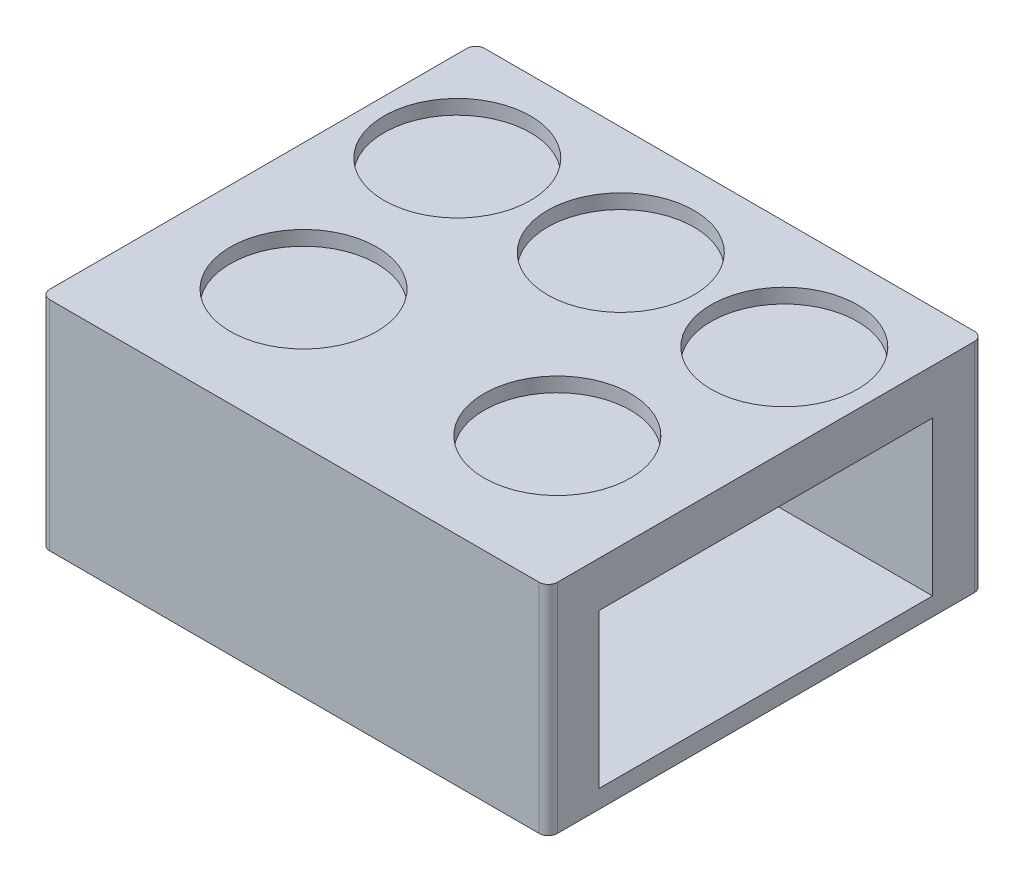
ISO-10303-21;
HEADER;
FILE_DESCRIPTION(('STEP AP214'),'2;1');
FILE_NAME('part.step','',(''),(''),'','','');
FILE_SCHEMA(('AUTOMOTIVE_DESIGN { 1 0 10303 214 1 1 1 1 }'));
ENDSEC;
DATA;
#1=APPLICATION_CONTEXT('core data for automotive mechanical design processes');
#2=APPLICATION_PROTOCOL_DEFINITION('international standard','automotive_design',2000,#1);
#3=PRODUCT_CONTEXT('',#1,'mechanical');
#4=PRODUCT('Part','Part','',(#3));
#5=PRODUCT_RELATED_PRODUCT_CATEGORY('part','',(#4));
#6=PRODUCT_DEFINITION_FORMATION('','',#4);
#7=PRODUCT_DEFINITION_CONTEXT('part definition',#1,'design');
#8=PRODUCT_DEFINITION('design','',#6,#7);
#9=PRODUCT_DEFINITION_SHAPE('','',#8);
#10=(LENGTH_UNIT() NAMED_UNIT(*) SI_UNIT(.MILLI.,.METRE.));
#11=(NAMED_UNIT(*) PLANE_ANGLE_UNIT() SI_UNIT($,.RADIAN.));
#12=(NAMED_UNIT(*) SI_UNIT($,.STERADIAN.) SOLID_ANGLE_UNIT());
#13=UNCERTAINTY_MEASURE_WITH_UNIT(LENGTH_MEASURE(1.E-05),#10,'distance_accuracy_value','');
#14=(GEOMETRIC_REPRESENTATION_CONTEXT(3) GLOBAL_UNCERTAINTY_ASSIGNED_CONTEXT((#13)) GLOBAL_UNIT_ASSIGNED_CONTEXT((#10,
#11,#12)) REPRESENTATION_CONTEXT('',''));
#15=CARTESIAN_POINT('',(0.,0.,0.));
#16=DIRECTION('',(0.,0.,1.));
#17=DIRECTION('',(1.,0.,0.));
#18=AXIS2_PLACEMENT_3D('',#15,#16,#17);
#19=CARTESIAN_POINT('',(135.,120.,-115.));
#20=DIRECTION('',(0.,-1.,0.));
#21=DIRECTION('',(0.,0.,-1.));
#22=AXIS2_PLACEMENT_3D('',#19,#20,#21);
#23=CYLINDRICAL_SURFACE('',#22,5.);
#24=CARTESIAN_POINT('',(135.,0.,-115.));
#25=DIRECTION('',(0.,1.,0.));
#26=DIRECTION('',(0.,0.,1.));
#27=AXIS2_PLACEMENT_3D('',#24,#25,#26);
#28=CIRCLE('',#27,5.);
#29=CARTESIAN_POINT('',(140.,0.,-115.));
#30=VERTEX_POINT('',#29);
#31=CARTESIAN_POINT('',(135.,0.,-120.));
#32=VERTEX_POINT('',#31);
#33=EDGE_CURVE('E182',#30,#32,#28,.T.);
#34=ORIENTED_EDGE('',*,*,#33,.T.);
#35=DIRECTION('',(0.,-1.,0.));
#36=VECTOR('',#35,1.);
#37=CARTESIAN_POINT('',(135.,120.,-120.));
#38=LINE('',#37,#36);
#39=CARTESIAN_POINT('',(135.,120.,-120.));
#40=VERTEX_POINT('',#39);
#41=EDGE_CURVE('E11',#40,#32,#38,.T.);
#42=ORIENTED_EDGE('',*,*,#41,.F.);
#43=CARTESIAN_POINT('',(135.,120.,-115.));
#44=DIRECTION('',(0.,1.,0.));
#45=DIRECTION('',(0.,0.,1.));
#46=AXIS2_PLACEMENT_3D('',#43,#44,#45);
#47=CIRCLE('',#46,5.);
#48=CARTESIAN_POINT('',(140.,120.,-115.));
#49=VERTEX_POINT('',#48);
#50=EDGE_CURVE('E183',#49,#40,#47,.T.);
#51=ORIENTED_EDGE('',*,*,#50,.F.);
#52=DIRECTION('',(0.,-1.,0.));
#53=VECTOR('',#52,1.);
#54=CARTESIAN_POINT('',(140.,120.,-115.));
#55=LINE('',#54,#53);
#56=EDGE_CURVE('E209',#49,#30,#55,.T.);
#57=ORIENTED_EDGE('',*,*,#56,.T.);
#58=EDGE_LOOP('',(#34,#42,#51,#57));
#59=FACE_BOUND('',#58,.T.);
#60=ADVANCED_FACE('F45',(#59),#23,.T.);
#61=CARTESIAN_POINT('',(0.,120.,-120.));
#62=DIRECTION('',(0.,0.,1.));
#63=DIRECTION('',(1.,0.,0.));
#64=AXIS2_PLACEMENT_3D('',#61,#62,#63);
#65=PLANE('',#64);
#66=DIRECTION('',(-1.,0.,0.));
#67=VECTOR('',#66,1.);
#68=CARTESIAN_POINT('',(0.,0.,-120.));
#69=LINE('',#68,#67);
#70=CARTESIAN_POINT('',(-135.,0.,-120.));
#71=VERTEX_POINT('',#70);
#72=EDGE_CURVE('E213',#32,#71,#69,.T.);
#73=ORIENTED_EDGE('',*,*,#72,.T.);
#74=DIRECTION('',(0.,-1.,0.));
#75=VECTOR('',#74,1.);
#76=CARTESIAN_POINT('',(-135.,120.,-120.));
#77=LINE('',#76,#75);
#78=CARTESIAN_POINT('',(-135.,120.,-120.));
#79=VERTEX_POINT('',#78);
#80=EDGE_CURVE('E53',#79,#71,#77,.T.);
#81=ORIENTED_EDGE('',*,*,#80,.F.);
#82=DIRECTION('',(-1.,0.,0.));
#83=VECTOR('',#82,1.);
#84=CARTESIAN_POINT('',(135.,120.,-120.));
#85=LINE('',#84,#83);
#86=EDGE_CURVE('E187',#40,#79,#85,.T.);
#87=ORIENTED_EDGE('',*,*,#86,.F.);
#88=ORIENTED_EDGE('',*,*,#41,.T.);
#89=EDGE_LOOP('',(#73,#81,#87,#88));
#90=FACE_BOUND('',#89,.T.);
#91=ADVANCED_FACE('F284',(#90),#65,.F.);
#92=CARTESIAN_POINT('',(-135.,120.,-115.));
#93=DIRECTION('',(0.,-1.,0.));
#94=DIRECTION('',(0.,0.,-1.));
#95=AXIS2_PLACEMENT_3D('',#92,#93,#94);
#96=CYLINDRICAL_SURFACE('',#95,5.);
#97=CARTESIAN_POINT('',(-135.,0.,-115.));
#98=DIRECTION('',(0.,1.,0.));
#99=DIRECTION('',(0.,0.,1.));
#100=AXIS2_PLACEMENT_3D('',#97,#98,#99);
#101=CIRCLE('',#100,5.);
#102=CARTESIAN_POINT('',(-140.,0.,-115.));
#103=VERTEX_POINT('',#102);
#104=EDGE_CURVE('E216',#71,#103,#101,.T.);
#105=ORIENTED_EDGE('',*,*,#104,.T.);
#106=DIRECTION('',(0.,-1.,0.));
#107=VECTOR('',#106,1.);
#108=CARTESIAN_POINT('',(-140.,120.,-115.));
#109=LINE('',#108,#107);
#110=CARTESIAN_POINT('',(-140.,120.,-115.));
#111=VERTEX_POINT('',#110);
#112=EDGE_CURVE('E252',#111,#103,#109,.T.);
#113=ORIENTED_EDGE('',*,*,#112,.F.);
#114=CARTESIAN_POINT('',(-135.,120.,-115.));
#115=DIRECTION('',(0.,1.,0.));
#116=DIRECTION('',(0.,0.,1.));
#117=AXIS2_PLACEMENT_3D('',#114,#115,#116);
#118=CIRCLE('',#117,5.);
#119=EDGE_CURVE('E191',#79,#111,#118,.T.);
#120=ORIENTED_EDGE('',*,*,#119,.F.);
#121=ORIENTED_EDGE('',*,*,#80,.T.);
#122=EDGE_LOOP('',(#105,#113,#120,#121));
#123=FACE_BOUND('',#122,.T.);
#124=ADVANCED_FACE('F261',(#123),#96,.T.);
#125=CARTESIAN_POINT('',(-140.,120.,-115.));
#126=DIRECTION('',(1.,0.,0.));
#127=DIRECTION('',(0.,0.,-1.));
#128=AXIS2_PLACEMENT_3D('',#125,#126,#127);
#129=PLANE('',#128);
#130=DIRECTION('',(0.,1.,0.));
#131=VECTOR('',#130,1.);
#132=CARTESIAN_POINT('',(-140.,120.,-92.));
#133=LINE('',#132,#131);
#134=CARTESIAN_POINT('',(-140.,9.99999999999999,-92.));
#135=VERTEX_POINT('',#134);
#136=CARTESIAN_POINT('',(-140.,95.,-92.));
#137=VERTEX_POINT('',#136);
#138=EDGE_CURVE('E174',#135,#137,#133,.T.);
#139=ORIENTED_EDGE('',*,*,#138,.T.);
#140=DIRECTION('',(0.,0.,1.));
#141=VECTOR('',#140,1.);
#142=CARTESIAN_POINT('',(-140.,95.,-115.));
#143=LINE('',#142,#141);
#144=CARTESIAN_POINT('',(-140.,95.,92.));
#145=VERTEX_POINT('',#144);
#146=EDGE_CURVE('E178',#137,#145,#143,.T.);
#147=ORIENTED_EDGE('',*,*,#146,.T.);
#148=DIRECTION('',(0.,-1.,0.));
#149=VECTOR('',#148,1.);
#150=CARTESIAN_POINT('',(-140.,120.,92.));
#151=LINE('',#150,#149);
#152=CARTESIAN_POINT('',(-140.,9.99999999999999,92.));
#153=VERTEX_POINT('',#152);
#154=EDGE_CURVE('E165',#145,#153,#151,.T.);
#155=ORIENTED_EDGE('',*,*,#154,.T.);
#156=DIRECTION('',(0.,0.,-1.));
#157=VECTOR('',#156,1.);
#158=CARTESIAN_POINT('',(-140.,9.99999999999999,-115.));
#159=LINE('',#158,#157);
#160=EDGE_CURVE('E140',#153,#135,#159,.T.);
#161=ORIENTED_EDGE('',*,*,#160,.T.);
#162=EDGE_LOOP('',(#139,#147,#155,#161));
#163=FACE_BOUND('',#162,.T.);
#164=DIRECTION('',(0.,0.,1.));
#165=VECTOR('',#164,1.);
#166=CARTESIAN_POINT('',(-140.,0.,-115.));
#167=LINE('',#166,#165);
#168=CARTESIAN_POINT('',(-140.,0.,115.));
#169=VERTEX_POINT('',#168);
#170=EDGE_CURVE('E219',#103,#169,#167,.T.);
#171=ORIENTED_EDGE('',*,*,#170,.T.);
#172=DIRECTION('',(0.,-1.,0.));
#173=VECTOR('',#172,1.);
#174=CARTESIAN_POINT('',(-140.,120.,115.));
#175=LINE('',#174,#173);
#176=CARTESIAN_POINT('',(-140.,120.,115.));
#177=VERTEX_POINT('',#176);
#178=EDGE_CURVE('E248',#177,#169,#175,.T.);
#179=ORIENTED_EDGE('',*,*,#178,.F.);
#180=DIRECTION('',(0.,0.,1.));
#181=VECTOR('',#180,1.);
#182=CARTESIAN_POINT('',(-140.,120.,-115.));
#183=LINE('',#182,#181);
#184=EDGE_CURVE('E194',#111,#177,#183,.T.);
#185=ORIENTED_EDGE('',*,*,#184,.F.);
#186=ORIENTED_EDGE('',*,*,#112,.T.);
#187=EDGE_LOOP('',(#171,#179,#185,#186));
#188=FACE_BOUND('',#187,.T.);
#189=ADVANCED_FACE('F272',(#163,#188),#129,.F.);
#190=CARTESIAN_POINT('',(-135.,120.,115.));
#191=DIRECTION('',(0.,-1.,0.));
#192=DIRECTION('',(0.,0.,-1.));
#193=AXIS2_PLACEMENT_3D('',#190,#191,#192);
#194=CYLINDRICAL_SURFACE('',#193,5.);
#195=CARTESIAN_POINT('',(-135.,0.,115.));
#196=DIRECTION('',(0.,1.,0.));
#197=DIRECTION('',(0.,0.,1.));
#198=AXIS2_PLACEMENT_3D('',#195,#196,#197);
#199=CIRCLE('',#198,5.);
#200=CARTESIAN_POINT('',(-135.,0.,120.));
#201=VERTEX_POINT('',#200);
#202=EDGE_CURVE('E222',#169,#201,#199,.T.);
#203=ORIENTED_EDGE('',*,*,#202,.T.);
#204=DIRECTION('',(0.,-1.,0.));
#205=VECTOR('',#204,1.);
#206=CARTESIAN_POINT('',(-135.,120.,120.));
#207=LINE('',#206,#205);
#208=CARTESIAN_POINT('',(-135.,120.,120.));
#209=VERTEX_POINT('',#208);
#210=EDGE_CURVE('E244',#209,#201,#207,.T.);
#211=ORIENTED_EDGE('',*,*,#210,.F.);
#212=CARTESIAN_POINT('',(-135.,120.,115.));
#213=DIRECTION('',(0.,1.,0.));
#214=DIRECTION('',(0.,0.,1.));
#215=AXIS2_PLACEMENT_3D('',#212,#213,#214);
#216=CIRCLE('',#215,5.);
#217=EDGE_CURVE('E197',#177,#209,#216,.T.);
#218=ORIENTED_EDGE('',*,*,#217,.F.);
#219=ORIENTED_EDGE('',*,*,#178,.T.);
#220=EDGE_LOOP('',(#203,#211,#218,#219));
#221=FACE_BOUND('',#220,.T.);
#222=ADVANCED_FACE('F276',(#221),#194,.T.);
#223=CARTESIAN_POINT('',(-135.,120.,120.));
#224=DIRECTION('',(0.,0.,-1.));
#225=DIRECTION('',(-1.,0.,0.));
#226=AXIS2_PLACEMENT_3D('',#223,#224,#225);
#227=PLANE('',#226);
#228=DIRECTION('',(1.,0.,0.));
#229=VECTOR('',#228,1.);
#230=CARTESIAN_POINT('',(-135.,0.,120.));
#231=LINE('',#230,#229);
#232=CARTESIAN_POINT('',(135.,0.,120.));
#233=VERTEX_POINT('',#232);
#234=EDGE_CURVE('E225',#201,#233,#231,.T.);
#235=ORIENTED_EDGE('',*,*,#234,.T.);
#236=DIRECTION('',(0.,-1.,0.));
#237=VECTOR('',#236,1.);
#238=CARTESIAN_POINT('',(135.,120.,120.));
#239=LINE('',#238,#237);
#240=CARTESIAN_POINT('',(135.,120.,120.));
#241=VERTEX_POINT('',#240);
#242=EDGE_CURVE('E240',#241,#233,#239,.T.);
#243=ORIENTED_EDGE('',*,*,#242,.F.);
#244=DIRECTION('',(1.,0.,0.));
#245=VECTOR('',#244,1.);
#246=CARTESIAN_POINT('',(-135.,120.,120.));
#247=LINE('',#246,#245);
#248=EDGE_CURVE('E200',#209,#241,#247,.T.);
#249=ORIENTED_EDGE('',*,*,#248,.F.);
#250=ORIENTED_EDGE('',*,*,#210,.T.);
#251=EDGE_LOOP('',(#235,#243,#249,#250));
#252=FACE_BOUND('',#251,.T.);
#253=ADVANCED_FACE('F295',(#252),#227,.F.);
#254=CARTESIAN_POINT('',(135.,120.,115.));
#255=DIRECTION('',(0.,-1.,0.));
#256=DIRECTION('',(0.,0.,-1.));
#257=AXIS2_PLACEMENT_3D('',#254,#255,#256);
#258=CYLINDRICAL_SURFACE('',#257,5.);
#259=CARTESIAN_POINT('',(135.,0.,115.));
#260=DIRECTION('',(0.,1.,0.));
#261=DIRECTION('',(0.,0.,1.));
#262=AXIS2_PLACEMENT_3D('',#259,#260,#261);
#263=CIRCLE('',#262,5.);
#264=CARTESIAN_POINT('',(140.,0.,115.));
#265=VERTEX_POINT('',#264);
#266=EDGE_CURVE('E228',#233,#265,#263,.T.);
#267=ORIENTED_EDGE('',*,*,#266,.T.);
#268=DIRECTION('',(0.,-1.,0.));
#269=VECTOR('',#268,1.);
#270=CARTESIAN_POINT('',(140.,120.,115.));
#271=LINE('',#270,#269);
#272=CARTESIAN_POINT('',(140.,120.,115.));
#273=VERTEX_POINT('',#272);
#274=EDGE_CURVE('E236',#273,#265,#271,.T.);
#275=ORIENTED_EDGE('',*,*,#274,.F.);
#276=CARTESIAN_POINT('',(135.,120.,115.));
#277=DIRECTION('',(0.,1.,0.));
#278=DIRECTION('',(0.,0.,1.));
#279=AXIS2_PLACEMENT_3D('',#276,#277,#278);
#280=CIRCLE('',#279,5.);
#281=EDGE_CURVE('E203',#241,#273,#280,.T.);
#282=ORIENTED_EDGE('',*,*,#281,.F.);
#283=ORIENTED_EDGE('',*,*,#242,.T.);
#284=EDGE_LOOP('',(#267,#275,#282,#283));
#285=FACE_BOUND('',#284,.T.);
#286=ADVANCED_FACE('F293',(#285),#258,.T.);
#287=CARTESIAN_POINT('',(140.,120.,115.));
#288=DIRECTION('',(-1.,0.,0.));
#289=DIRECTION('',(0.,0.,1.));
#290=AXIS2_PLACEMENT_3D('',#287,#288,#289);
#291=PLANE('',#290);
#292=DIRECTION('',(0.,-1.,0.));
#293=VECTOR('',#292,1.);
#294=CARTESIAN_POINT('',(140.,95.,92.));
#295=LINE('',#294,#293);
#296=CARTESIAN_POINT('',(140.,95.,92.));
#297=VERTEX_POINT('',#296);
#298=CARTESIAN_POINT('',(140.,9.99999999999999,92.));
#299=VERTEX_POINT('',#298);
#300=EDGE_CURVE('E147',#297,#299,#295,.T.);
#301=ORIENTED_EDGE('',*,*,#300,.F.);
#302=DIRECTION('',(0.,0.,1.));
#303=VECTOR('',#302,1.);
#304=CARTESIAN_POINT('',(140.,95.,92.));
#305=LINE('',#304,#303);
#306=CARTESIAN_POINT('',(140.,95.,-92.));
#307=VERTEX_POINT('',#306);
#308=EDGE_CURVE('E68',#307,#297,#305,.T.);
#309=ORIENTED_EDGE('',*,*,#308,.F.);
#310=DIRECTION('',(0.,1.,0.));
#311=VECTOR('',#310,1.);
#312=CARTESIAN_POINT('',(140.,9.99999999999999,-92.));
#313=LINE('',#312,#311);
#314=CARTESIAN_POINT('',(140.,9.99999999999999,-92.));
#315=VERTEX_POINT('',#314);
#316=EDGE_CURVE('E155',#315,#307,#313,.T.);
#317=ORIENTED_EDGE('',*,*,#316,.F.);
#318=DIRECTION('',(0.,0.,-1.));
#319=VECTOR('',#318,1.);
#320=CARTESIAN_POINT('',(140.,9.99999999999999,92.));
#321=LINE('',#320,#319);
#322=EDGE_CURVE('E137',#299,#315,#321,.T.);
#323=ORIENTED_EDGE('',*,*,#322,.F.);
#324=EDGE_LOOP('',(#301,#309,#317,#323));
#325=FACE_BOUND('',#324,.T.);
#326=DIRECTION('',(0.,0.,-1.));
#327=VECTOR('',#326,1.);
#328=CARTESIAN_POINT('',(140.,0.,115.));
#329=LINE('',#328,#327);
#330=EDGE_CURVE('E188',#265,#30,#329,.T.);
#331=ORIENTED_EDGE('',*,*,#330,.T.);
#332=ORIENTED_EDGE('',*,*,#56,.F.);
#333=DIRECTION('',(0.,0.,-1.));
#334=VECTOR('',#333,1.);
#335=CARTESIAN_POINT('',(140.,120.,115.));
#336=LINE('',#335,#334);
#337=EDGE_CURVE('E206',#273,#49,#336,.T.);
#338=ORIENTED_EDGE('',*,*,#337,.F.);
#339=ORIENTED_EDGE('',*,*,#274,.T.);
#340=EDGE_LOOP('',(#331,#332,#338,#339));
#341=FACE_BOUND('',#340,.T.);
#342=ADVANCED_FACE('F152',(#325,#341),#291,.F.);
#343=CARTESIAN_POINT('',(135.,120.,-115.));
#344=DIRECTION('',(0.,1.,0.));
#345=DIRECTION('',(0.,0.,1.));
#346=AXIS2_PLACEMENT_3D('',#343,#344,#345);
#347=PLANE('',#346);
#348=CARTESIAN_POINT('',(-70.,120.,45.));
#349=DIRECTION('',(0.,1.,0.));
#350=DIRECTION('',(0.,0.,-1.));
#351=AXIS2_PLACEMENT_3D('',#348,#349,#350);
#352=CIRCLE('',#351,40.4);
#353=CARTESIAN_POINT('',(-70.,120.,4.59999999999998));
#354=VERTEX_POINT('',#353);
#355=EDGE_CURVE('E486',#354,#354,#352,.T.);
#356=ORIENTED_EDGE('',*,*,#355,.F.);
#357=EDGE_LOOP('',(#356));
#358=FACE_BOUND('',#357,.T.);
#359=CARTESIAN_POINT('',(0.,120.,-60.));
#360=DIRECTION('',(0.,1.,0.));
#361=DIRECTION('',(0.,0.,1.));
#362=AXIS2_PLACEMENT_3D('',#359,#360,#361);
#363=CIRCLE('',#362,40.4);
#364=CARTESIAN_POINT('',(0.,120.,-19.6));
#365=VERTEX_POINT('',#364);
#366=EDGE_CURVE('E487',#365,#365,#363,.T.);
#367=ORIENTED_EDGE('',*,*,#366,.F.);
#368=EDGE_LOOP('',(#367));
#369=FACE_BOUND('',#368,.T.);
#370=CARTESIAN_POINT('',(-90.2,120.,-60.));
#371=DIRECTION('',(0.,1.,0.));
#372=DIRECTION('',(0.,0.,1.));
#373=AXIS2_PLACEMENT_3D('',#370,#371,#372);
#374=CIRCLE('',#373,40.4);
#375=CARTESIAN_POINT('',(-90.2,120.,-19.6));
#376=VERTEX_POINT('',#375);
#377=EDGE_CURVE('E502',#376,#376,#374,.T.);
#378=ORIENTED_EDGE('',*,*,#377,.F.);
#379=EDGE_LOOP('',(#378));
#380=FACE_BOUND('',#379,.T.);
#381=CARTESIAN_POINT('',(90.2,120.,-60.));
#382=DIRECTION('',(0.,1.,0.));
#383=DIRECTION('',(0.,0.,1.));
#384=AXIS2_PLACEMENT_3D('',#381,#382,#383);
#385=CIRCLE('',#384,40.4);
#386=CARTESIAN_POINT('',(90.2,120.,-19.6));
#387=VERTEX_POINT('',#386);
#388=EDGE_CURVE('E523',#387,#387,#385,.T.);
#389=ORIENTED_EDGE('',*,*,#388,.F.);
#390=EDGE_LOOP('',(#389));
#391=FACE_BOUND('',#390,.T.);
#392=CARTESIAN_POINT('',(70.,120.,45.));
#393=DIRECTION('',(0.,1.,0.));
#394=DIRECTION('',(0.,0.,1.));
#395=AXIS2_PLACEMENT_3D('',#392,#393,#394);
#396=CIRCLE('',#395,40.4);
#397=CARTESIAN_POINT('',(70.,120.,85.4));
#398=VERTEX_POINT('',#397);
#399=EDGE_CURVE('E492',#398,#398,#396,.T.);
#400=ORIENTED_EDGE('',*,*,#399,.F.);
#401=EDGE_LOOP('',(#400));
#402=FACE_BOUND('',#401,.T.);
#403=ORIENTED_EDGE('',*,*,#50,.T.);
#404=ORIENTED_EDGE('',*,*,#86,.T.);
#405=ORIENTED_EDGE('',*,*,#119,.T.);
#406=ORIENTED_EDGE('',*,*,#184,.T.);
#407=ORIENTED_EDGE('',*,*,#217,.T.);
#408=ORIENTED_EDGE('',*,*,#248,.T.);
#409=ORIENTED_EDGE('',*,*,#281,.T.);
#410=ORIENTED_EDGE('',*,*,#337,.T.);
#411=EDGE_LOOP('',(#403,#404,#405,#406,#407,#408,#409,#410));
#412=FACE_BOUND('',#411,.T.);
#413=ADVANCED_FACE('F280',(#358,#369,#380,#391,#402,#412),#347,.T.);
#414=CARTESIAN_POINT('',(135.,0.,-115.));
#415=DIRECTION('',(0.,1.,0.));
#416=DIRECTION('',(0.,0.,1.));
#417=AXIS2_PLACEMENT_3D('',#414,#415,#416);
#418=PLANE('',#417);
#419=ORIENTED_EDGE('',*,*,#33,.F.);
#420=ORIENTED_EDGE('',*,*,#330,.F.);
#421=ORIENTED_EDGE('',*,*,#266,.F.);
#422=ORIENTED_EDGE('',*,*,#234,.F.);
#423=ORIENTED_EDGE('',*,*,#202,.F.);
#424=ORIENTED_EDGE('',*,*,#170,.F.);
#425=ORIENTED_EDGE('',*,*,#104,.F.);
#426=ORIENTED_EDGE('',*,*,#72,.F.);
#427=EDGE_LOOP('',(#419,#420,#421,#422,#423,#424,#425,#426));
#428=FACE_BOUND('',#427,.T.);
#429=ADVANCED_FACE('F267',(#428),#418,.F.);
#430=CARTESIAN_POINT('',(-230.,95.,92.));
#431=DIRECTION('',(0.,1.,0.));
#432=DIRECTION('',(0.,0.,1.));
#433=AXIS2_PLACEMENT_3D('',#430,#431,#432);
#434=PLANE('',#433);
#435=DIRECTION('',(1.,0.,0.));
#436=VECTOR('',#435,1.);
#437=CARTESIAN_POINT('',(-230.,95.,-92.));
#438=LINE('',#437,#436);
#439=EDGE_CURVE('E162',#137,#307,#438,.T.);
#440=ORIENTED_EDGE('',*,*,#439,.T.);
#441=ORIENTED_EDGE('',*,*,#308,.T.);
#442=DIRECTION('',(1.,0.,0.));
#443=VECTOR('',#442,1.);
#444=CARTESIAN_POINT('',(-230.,95.,92.));
#445=LINE('',#444,#443);
#446=EDGE_CURVE('E144',#145,#297,#445,.T.);
#447=ORIENTED_EDGE('',*,*,#446,.F.);
#448=ORIENTED_EDGE('',*,*,#146,.F.);
#449=EDGE_LOOP('',(#440,#441,#447,#448));
#450=FACE_BOUND('',#449,.T.);
#451=ADVANCED_FACE('F322',(#450),#434,.F.);
#452=CARTESIAN_POINT('',(-230.,9.99999999999999,-92.));
#453=DIRECTION('',(0.,0.,-1.));
#454=DIRECTION('',(-1.,0.,0.));
#455=AXIS2_PLACEMENT_3D('',#452,#453,#454);
#456=PLANE('',#455);
#457=DIRECTION('',(1.,0.,0.));
#458=VECTOR('',#457,1.);
#459=CARTESIAN_POINT('',(-230.,9.99999999999999,-92.));
#460=LINE('',#459,#458);
#461=EDGE_CURVE('E143',#135,#315,#460,.T.);
#462=ORIENTED_EDGE('',*,*,#461,.T.);
#463=ORIENTED_EDGE('',*,*,#316,.T.);
#464=ORIENTED_EDGE('',*,*,#439,.F.);
#465=ORIENTED_EDGE('',*,*,#138,.F.);
#466=EDGE_LOOP('',(#462,#463,#464,#465));
#467=FACE_BOUND('',#466,.T.);
#468=ADVANCED_FACE('F321',(#467),#456,.F.);
#469=CARTESIAN_POINT('',(-230.,9.99999999999999,92.));
#470=DIRECTION('',(0.,-1.,0.));
#471=DIRECTION('',(0.,0.,-1.));
#472=AXIS2_PLACEMENT_3D('',#469,#470,#471);
#473=PLANE('',#472);
#474=DIRECTION('',(1.,0.,0.));
#475=VECTOR('',#474,1.);
#476=CARTESIAN_POINT('',(-230.,9.99999999999999,92.));
#477=LINE('',#476,#475);
#478=EDGE_CURVE('E60',#153,#299,#477,.T.);
#479=ORIENTED_EDGE('',*,*,#478,.T.);
#480=ORIENTED_EDGE('',*,*,#322,.T.);
#481=ORIENTED_EDGE('',*,*,#461,.F.);
#482=ORIENTED_EDGE('',*,*,#160,.F.);
#483=EDGE_LOOP('',(#479,#480,#481,#482));
#484=FACE_BOUND('',#483,.T.);
#485=ADVANCED_FACE('F134',(#484),#473,.F.);
#486=CARTESIAN_POINT('',(-230.,95.,92.));
#487=DIRECTION('',(0.,0.,1.));
#488=DIRECTION('',(1.,0.,0.));
#489=AXIS2_PLACEMENT_3D('',#486,#487,#488);
#490=PLANE('',#489);
#491=ORIENTED_EDGE('',*,*,#446,.T.);
#492=ORIENTED_EDGE('',*,*,#300,.T.);
#493=ORIENTED_EDGE('',*,*,#478,.F.);
#494=ORIENTED_EDGE('',*,*,#154,.F.);
#495=EDGE_LOOP('',(#491,#492,#493,#494));
#496=FACE_BOUND('',#495,.T.);
#497=ADVANCED_FACE('F148',(#496),#490,.F.);
#498=CARTESIAN_POINT('',(70.,112.,45.));
#499=DIRECTION('',(0.,1.,0.));
#500=DIRECTION('',(0.,0.,1.));
#501=AXIS2_PLACEMENT_3D('',#498,#499,#500);
#502=CYLINDRICAL_SURFACE('',#501,40.4);
#503=CARTESIAN_POINT('',(70.,112.,45.));
#504=DIRECTION('',(0.,1.,0.));
#505=DIRECTION('',(0.,0.,1.));
#506=AXIS2_PLACEMENT_3D('',#503,#504,#505);
#507=CIRCLE('',#506,40.4);
#508=CARTESIAN_POINT('',(70.,112.,85.4));
#509=VERTEX_POINT('',#508);
#510=EDGE_CURVE('E503',#509,#509,#507,.T.);
#511=ORIENTED_EDGE('',*,*,#510,.F.);
#512=EDGE_LOOP('',(#511));
#513=FACE_BOUND('',#512,.T.);
#514=ORIENTED_EDGE('',*,*,#399,.T.);
#515=EDGE_LOOP('',(#514));
#516=FACE_BOUND('',#515,.T.);
#517=ADVANCED_FACE('F382',(#513,#516),#502,.F.);
#518=CARTESIAN_POINT('',(70.,112.,45.));
#519=DIRECTION('',(0.,1.,0.));
#520=DIRECTION('',(0.,0.,1.));
#521=AXIS2_PLACEMENT_3D('',#518,#519,#520);
#522=PLANE('',#521);
#523=ORIENTED_EDGE('',*,*,#510,.T.);
#524=EDGE_LOOP('',(#523));
#525=FACE_BOUND('',#524,.T.);
#526=ADVANCED_FACE('F389',(#525),#522,.T.);
#527=CARTESIAN_POINT('',(90.2,112.,-60.));
#528=DIRECTION('',(0.,1.,0.));
#529=DIRECTION('',(0.,0.,1.));
#530=AXIS2_PLACEMENT_3D('',#527,#528,#529);
#531=CYLINDRICAL_SURFACE('',#530,40.4);
#532=CARTESIAN_POINT('',(90.2,112.,-60.));
#533=DIRECTION('',(0.,1.,0.));
#534=DIRECTION('',(0.,0.,1.));
#535=AXIS2_PLACEMENT_3D('',#532,#533,#534);
#536=CIRCLE('',#535,40.4);
#537=CARTESIAN_POINT('',(90.2,112.,-19.6));
#538=VERTEX_POINT('',#537);
#539=EDGE_CURVE('E528',#538,#538,#536,.T.);
#540=ORIENTED_EDGE('',*,*,#539,.F.);
#541=EDGE_LOOP('',(#540));
#542=FACE_BOUND('',#541,.T.);
#543=ORIENTED_EDGE('',*,*,#388,.T.);
#544=EDGE_LOOP('',(#543));
#545=FACE_BOUND('',#544,.T.);
#546=ADVANCED_FACE('F399',(#542,#545),#531,.F.);
#547=CARTESIAN_POINT('',(90.2,112.,-60.));
#548=DIRECTION('',(0.,1.,0.));
#549=DIRECTION('',(0.,0.,1.));
#550=AXIS2_PLACEMENT_3D('',#547,#548,#549);
#551=PLANE('',#550);
#552=ORIENTED_EDGE('',*,*,#539,.T.);
#553=EDGE_LOOP('',(#552));
#554=FACE_BOUND('',#553,.T.);
#555=ADVANCED_FACE('F409',(#554),#551,.T.);
#556=CARTESIAN_POINT('',(-90.2,112.,-60.));
#557=DIRECTION('',(0.,1.,0.));
#558=DIRECTION('',(0.,0.,1.));
#559=AXIS2_PLACEMENT_3D('',#556,#557,#558);
#560=CYLINDRICAL_SURFACE('',#559,40.4);
#561=CARTESIAN_POINT('',(-90.2,112.,-60.));
#562=DIRECTION('',(0.,1.,0.));
#563=DIRECTION('',(0.,0.,1.));
#564=AXIS2_PLACEMENT_3D('',#561,#562,#563);
#565=CIRCLE('',#564,40.4);
#566=CARTESIAN_POINT('',(-90.2,112.,-19.6));
#567=VERTEX_POINT('',#566);
#568=EDGE_CURVE('E517',#567,#567,#565,.T.);
#569=ORIENTED_EDGE('',*,*,#568,.F.);
#570=EDGE_LOOP('',(#569));
#571=FACE_BOUND('',#570,.T.);
#572=ORIENTED_EDGE('',*,*,#377,.T.);
#573=EDGE_LOOP('',(#572));
#574=FACE_BOUND('',#573,.T.);
#575=ADVANCED_FACE('F419',(#571,#574),#560,.F.);
#576=CARTESIAN_POINT('',(-90.2,112.,-60.));
#577=DIRECTION('',(0.,1.,0.));
#578=DIRECTION('',(0.,0.,1.));
#579=AXIS2_PLACEMENT_3D('',#576,#577,#578);
#580=PLANE('',#579);
#581=ORIENTED_EDGE('',*,*,#568,.T.);
#582=EDGE_LOOP('',(#581));
#583=FACE_BOUND('',#582,.T.);
#584=ADVANCED_FACE('F429',(#583),#580,.T.);
#585=CARTESIAN_POINT('',(0.,112.,-60.));
#586=DIRECTION('',(0.,1.,0.));
#587=DIRECTION('',(0.,0.,1.));
#588=AXIS2_PLACEMENT_3D('',#585,#586,#587);
#589=CYLINDRICAL_SURFACE('',#588,40.4);
#590=CARTESIAN_POINT('',(0.,112.,-60.));
#591=DIRECTION('',(0.,1.,0.));
#592=DIRECTION('',(0.,0.,1.));
#593=AXIS2_PLACEMENT_3D('',#590,#591,#592);
#594=CIRCLE('',#593,40.4);
#595=CARTESIAN_POINT('',(0.,112.,-19.6));
#596=VERTEX_POINT('',#595);
#597=EDGE_CURVE('E495',#596,#596,#594,.T.);
#598=ORIENTED_EDGE('',*,*,#597,.F.);
#599=EDGE_LOOP('',(#598));
#600=FACE_BOUND('',#599,.T.);
#601=ORIENTED_EDGE('',*,*,#366,.T.);
#602=EDGE_LOOP('',(#601));
#603=FACE_BOUND('',#602,.T.);
#604=ADVANCED_FACE('F439',(#600,#603),#589,.F.);
#605=CARTESIAN_POINT('',(0.,112.,-60.));
#606=DIRECTION('',(0.,1.,0.));
#607=DIRECTION('',(0.,0.,1.));
#608=AXIS2_PLACEMENT_3D('',#605,#606,#607);
#609=PLANE('',#608);
#610=ORIENTED_EDGE('',*,*,#597,.T.);
#611=EDGE_LOOP('',(#610));
#612=FACE_BOUND('',#611,.T.);
#613=ADVANCED_FACE('F449',(#612),#609,.T.);
#614=CARTESIAN_POINT('',(-70.,112.,45.));
#615=DIRECTION('',(0.,1.,0.));
#616=DIRECTION('',(0.,0.,1.));
#617=AXIS2_PLACEMENT_3D('',#614,#615,#616);
#618=CYLINDRICAL_SURFACE('',#617,40.4);
#619=CARTESIAN_POINT('',(-70.,112.,45.));
#620=DIRECTION('',(0.,1.,0.));
#621=DIRECTION('',(0.,0.,-1.));
#622=AXIS2_PLACEMENT_3D('',#619,#620,#621);
#623=CIRCLE('',#622,40.4);
#624=CARTESIAN_POINT('',(-70.,112.,4.59999999999998));
#625=VERTEX_POINT('',#624);
#626=EDGE_CURVE('E484',#625,#625,#623,.T.);
#627=ORIENTED_EDGE('',*,*,#626,.F.);
#628=EDGE_LOOP('',(#627));
#629=FACE_BOUND('',#628,.T.);
#630=ORIENTED_EDGE('',*,*,#355,.T.);
#631=EDGE_LOOP('',(#630));
#632=FACE_BOUND('',#631,.T.);
#633=ADVANCED_FACE('F459',(#629,#632),#618,.F.);
#634=CARTESIAN_POINT('',(-70.,112.,45.));
#635=DIRECTION('',(0.,-1.,0.));
#636=DIRECTION('',(0.,0.,-1.));
#637=AXIS2_PLACEMENT_3D('',#634,#635,#636);
#638=PLANE('',#637);
#639=ORIENTED_EDGE('',*,*,#626,.T.);
#640=EDGE_LOOP('',(#639));
#641=FACE_BOUND('',#640,.T.);
#642=ADVANCED_FACE('F469',(#641),#638,.F.);
#643=CLOSED_SHELL('',(#60,#91,#124,#189,#222,#253,#286,#342,#413,#429,#451,#468,#485,#497,#517,
#526,#546,#555,#575,#584,#604,#613,#633,#642));
#644=MANIFOLD_SOLID_BREP('B2',#643);
#645=ADVANCED_BREP_SHAPE_REPRESENTATION('',(#18,#644),#14);
#646=SHAPE_DEFINITION_REPRESENTATION(#9,#645);
ENDSEC;
END-ISO-10303-21;
